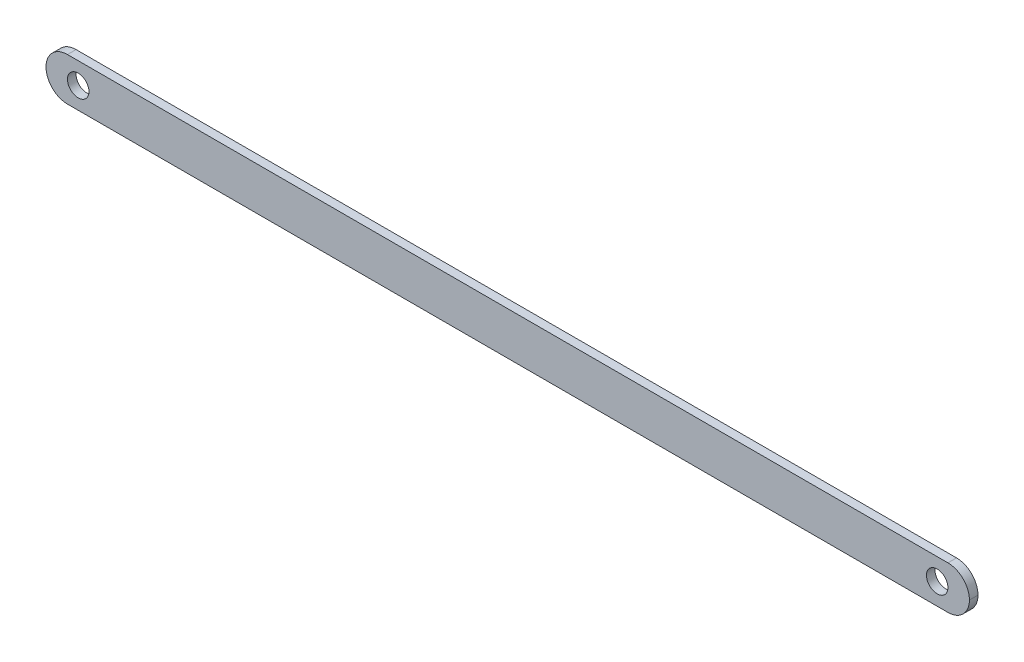
ISO-10303-21;
HEADER;
FILE_DESCRIPTION(('STEP AP214'),'2;1');
FILE_NAME('part.step','',(''),(''),'','','');
FILE_SCHEMA(('AUTOMOTIVE_DESIGN { 1 0 10303 214 1 1 1 1 }'));
ENDSEC;
DATA;
#1=APPLICATION_CONTEXT('core data for automotive mechanical design processes');
#2=APPLICATION_PROTOCOL_DEFINITION('international standard','automotive_design',2000,#1);
#3=PRODUCT_CONTEXT('',#1,'mechanical');
#4=PRODUCT('Part','Part','',(#3));
#5=PRODUCT_RELATED_PRODUCT_CATEGORY('part','',(#4));
#6=PRODUCT_DEFINITION_FORMATION('','',#4);
#7=PRODUCT_DEFINITION_CONTEXT('part definition',#1,'design');
#8=PRODUCT_DEFINITION('design','',#6,#7);
#9=PRODUCT_DEFINITION_SHAPE('','',#8);
#10=(LENGTH_UNIT() NAMED_UNIT(*) SI_UNIT(.MILLI.,.METRE.));
#11=(NAMED_UNIT(*) PLANE_ANGLE_UNIT() SI_UNIT($,.RADIAN.));
#12=(NAMED_UNIT(*) SI_UNIT($,.STERADIAN.) SOLID_ANGLE_UNIT());
#13=UNCERTAINTY_MEASURE_WITH_UNIT(LENGTH_MEASURE(1.E-05),#10,'distance_accuracy_value','');
#14=(GEOMETRIC_REPRESENTATION_CONTEXT(3) GLOBAL_UNCERTAINTY_ASSIGNED_CONTEXT((#13)) GLOBAL_UNIT_ASSIGNED_CONTEXT((#10,
#11,#12)) REPRESENTATION_CONTEXT('',''));
#15=CARTESIAN_POINT('',(0.,0.,0.));
#16=DIRECTION('',(0.,0.,1.));
#17=DIRECTION('',(1.,0.,0.));
#18=AXIS2_PLACEMENT_3D('',#15,#16,#17);
#19=CARTESIAN_POINT('',(107.5,5.00000000000001,-2.));
#20=DIRECTION('',(0.,1.,0.));
#21=DIRECTION('',(-1.,0.,0.));
#22=AXIS2_PLACEMENT_3D('',#19,#20,#21);
#23=PLANE('',#22);
#24=DIRECTION('',(-1.,0.,0.));
#25=VECTOR('',#24,1.);
#26=CARTESIAN_POINT('',(107.5,5.00000000000001,0.));
#27=LINE('',#26,#25);
#28=CARTESIAN_POINT('',(102.5,5.00000000000001,0.));
#29=VERTEX_POINT('',#28);
#30=CARTESIAN_POINT('',(-102.5,4.99999999999999,0.));
#31=VERTEX_POINT('',#30);
#32=EDGE_CURVE('E115',#29,#31,#27,.T.);
#33=ORIENTED_EDGE('',*,*,#32,.F.);
#34=DIRECTION('',(0.,0.,1.));
#35=VECTOR('',#34,1.);
#36=CARTESIAN_POINT('',(102.5,5.00000000000001,-2.));
#37=LINE('',#36,#35);
#38=CARTESIAN_POINT('',(102.5,5.00000000000001,-2.));
#39=VERTEX_POINT('',#38);
#40=EDGE_CURVE('E11',#29,#39,#37,.F.);
#41=ORIENTED_EDGE('',*,*,#40,.T.);
#42=DIRECTION('',(-1.,0.,0.));
#43=VECTOR('',#42,1.);
#44=CARTESIAN_POINT('',(107.5,5.00000000000001,-2.));
#45=LINE('',#44,#43);
#46=CARTESIAN_POINT('',(-102.5,4.99999999999999,-2.));
#47=VERTEX_POINT('',#46);
#48=EDGE_CURVE('E120',#39,#47,#45,.T.);
#49=ORIENTED_EDGE('',*,*,#48,.T.);
#50=DIRECTION('',(0.,0.,1.));
#51=VECTOR('',#50,1.);
#52=CARTESIAN_POINT('',(-102.5,4.99999999999999,-2.));
#53=LINE('',#52,#51);
#54=EDGE_CURVE('E48',#47,#31,#53,.T.);
#55=ORIENTED_EDGE('',*,*,#54,.T.);
#56=EDGE_LOOP('',(#33,#41,#49,#55));
#57=FACE_BOUND('',#56,.T.);
#58=ADVANCED_FACE('F39',(#57),#23,.T.);
#59=CARTESIAN_POINT('',(107.5,-4.99999999999999,-2.));
#60=DIRECTION('',(0.,-1.,0.));
#61=DIRECTION('',(1.,0.,0.));
#62=AXIS2_PLACEMENT_3D('',#59,#60,#61);
#63=PLANE('',#62);
#64=DIRECTION('',(1.,0.,0.));
#65=VECTOR('',#64,1.);
#66=CARTESIAN_POINT('',(107.5,-4.99999999999999,-2.));
#67=LINE('',#66,#65);
#68=CARTESIAN_POINT('',(-102.5,-5.00000000000001,-2.));
#69=VERTEX_POINT('',#68);
#70=CARTESIAN_POINT('',(102.5,-4.99999999999999,-2.));
#71=VERTEX_POINT('',#70);
#72=EDGE_CURVE('E123',#69,#71,#67,.T.);
#73=ORIENTED_EDGE('',*,*,#72,.T.);
#74=DIRECTION('',(0.,0.,1.));
#75=VECTOR('',#74,1.);
#76=CARTESIAN_POINT('',(102.5,-4.99999999999999,-2.));
#77=LINE('',#76,#75);
#78=CARTESIAN_POINT('',(102.5,-4.99999999999999,0.));
#79=VERTEX_POINT('',#78);
#80=EDGE_CURVE('E114',#71,#79,#77,.T.);
#81=ORIENTED_EDGE('',*,*,#80,.T.);
#82=DIRECTION('',(1.,0.,0.));
#83=VECTOR('',#82,1.);
#84=CARTESIAN_POINT('',(107.5,-4.99999999999999,0.));
#85=LINE('',#84,#83);
#86=CARTESIAN_POINT('',(-102.5,-5.00000000000001,0.));
#87=VERTEX_POINT('',#86);
#88=EDGE_CURVE('E96',#87,#79,#85,.T.);
#89=ORIENTED_EDGE('',*,*,#88,.F.);
#90=DIRECTION('',(0.,0.,1.));
#91=VECTOR('',#90,1.);
#92=CARTESIAN_POINT('',(-102.5,-5.00000000000001,-2.));
#93=LINE('',#92,#91);
#94=EDGE_CURVE('E111',#87,#69,#93,.F.);
#95=ORIENTED_EDGE('',*,*,#94,.T.);
#96=EDGE_LOOP('',(#73,#81,#89,#95));
#97=FACE_BOUND('',#96,.T.);
#98=ADVANCED_FACE('F110',(#97),#63,.T.);
#99=CARTESIAN_POINT('',(0.,0.,-2.));
#100=DIRECTION('',(0.,0.,1.));
#101=DIRECTION('',(1.,0.,0.));
#102=AXIS2_PLACEMENT_3D('',#99,#100,#101);
#103=PLANE('',#102);
#104=CARTESIAN_POINT('',(100.,0.,-2.));
#105=DIRECTION('',(0.,0.,1.));
#106=DIRECTION('',(1.,0.,0.));
#107=AXIS2_PLACEMENT_3D('',#104,#105,#106);
#108=CIRCLE('',#107,2.5);
#109=CARTESIAN_POINT('',(102.5,0.,-2.));
#110=VERTEX_POINT('',#109);
#111=EDGE_CURVE('E116',#110,#110,#108,.T.);
#112=ORIENTED_EDGE('',*,*,#111,.T.);
#113=EDGE_LOOP('',(#112));
#114=FACE_BOUND('',#113,.T.);
#115=CARTESIAN_POINT('',(-100.,0.,-2.));
#116=DIRECTION('',(0.,0.,1.));
#117=DIRECTION('',(-1.,0.,0.));
#118=AXIS2_PLACEMENT_3D('',#115,#116,#117);
#119=CIRCLE('',#118,2.5);
#120=CARTESIAN_POINT('',(-102.5,0.,-2.));
#121=VERTEX_POINT('',#120);
#122=EDGE_CURVE('E142',#121,#121,#119,.T.);
#123=ORIENTED_EDGE('',*,*,#122,.T.);
#124=EDGE_LOOP('',(#123));
#125=FACE_BOUND('',#124,.T.);
#126=CARTESIAN_POINT('',(102.5,0.,-2.));
#127=DIRECTION('',(0.,0.,1.));
#128=DIRECTION('',(1.,0.,0.));
#129=AXIS2_PLACEMENT_3D('',#126,#127,#128);
#130=CIRCLE('',#129,5.);
#131=CARTESIAN_POINT('',(107.5,0.,-2.));
#132=VERTEX_POINT('',#131);
#133=EDGE_CURVE('E56',#39,#132,#130,.F.);
#134=ORIENTED_EDGE('',*,*,#133,.T.);
#135=CARTESIAN_POINT('',(102.5,0.,-2.));
#136=DIRECTION('',(0.,0.,1.));
#137=DIRECTION('',(1.,0.,0.));
#138=AXIS2_PLACEMENT_3D('',#135,#136,#137);
#139=CIRCLE('',#138,5.);
#140=EDGE_CURVE('E134',#132,#71,#139,.F.);
#141=ORIENTED_EDGE('',*,*,#140,.T.);
#142=ORIENTED_EDGE('',*,*,#72,.F.);
#143=CARTESIAN_POINT('',(-102.5,0.,-2.));
#144=DIRECTION('',(0.,0.,1.));
#145=DIRECTION('',(1.,0.,0.));
#146=AXIS2_PLACEMENT_3D('',#143,#144,#145);
#147=CIRCLE('',#146,5.);
#148=CARTESIAN_POINT('',(-107.5,0.,-2.));
#149=VERTEX_POINT('',#148);
#150=EDGE_CURVE('E119',#69,#149,#147,.F.);
#151=ORIENTED_EDGE('',*,*,#150,.T.);
#152=CARTESIAN_POINT('',(-102.5,0.,-2.));
#153=DIRECTION('',(0.,0.,1.));
#154=DIRECTION('',(1.,0.,0.));
#155=AXIS2_PLACEMENT_3D('',#152,#153,#154);
#156=CIRCLE('',#155,5.);
#157=EDGE_CURVE('E62',#149,#47,#156,.F.);
#158=ORIENTED_EDGE('',*,*,#157,.T.);
#159=ORIENTED_EDGE('',*,*,#48,.F.);
#160=EDGE_LOOP('',(#134,#141,#142,#151,#158,#159));
#161=FACE_BOUND('',#160,.T.);
#162=ADVANCED_FACE('F160',(#114,#125,#161),#103,.F.);
#163=CARTESIAN_POINT('',(0.,0.,0.));
#164=DIRECTION('',(0.,0.,1.));
#165=DIRECTION('',(1.,0.,0.));
#166=AXIS2_PLACEMENT_3D('',#163,#164,#165);
#167=PLANE('',#166);
#168=CARTESIAN_POINT('',(100.,0.,0.));
#169=DIRECTION('',(0.,0.,1.));
#170=DIRECTION('',(1.,0.,0.));
#171=AXIS2_PLACEMENT_3D('',#168,#169,#170);
#172=CIRCLE('',#171,2.5);
#173=CARTESIAN_POINT('',(102.5,0.,0.));
#174=VERTEX_POINT('',#173);
#175=EDGE_CURVE('E154',#174,#174,#172,.T.);
#176=ORIENTED_EDGE('',*,*,#175,.F.);
#177=EDGE_LOOP('',(#176));
#178=FACE_BOUND('',#177,.T.);
#179=CARTESIAN_POINT('',(-100.,0.,0.));
#180=DIRECTION('',(0.,0.,1.));
#181=DIRECTION('',(-1.,0.,0.));
#182=AXIS2_PLACEMENT_3D('',#179,#180,#181);
#183=CIRCLE('',#182,2.5);
#184=CARTESIAN_POINT('',(-102.5,0.,0.));
#185=VERTEX_POINT('',#184);
#186=EDGE_CURVE('E138',#185,#185,#183,.T.);
#187=ORIENTED_EDGE('',*,*,#186,.F.);
#188=EDGE_LOOP('',(#187));
#189=FACE_BOUND('',#188,.T.);
#190=ORIENTED_EDGE('',*,*,#88,.T.);
#191=CARTESIAN_POINT('',(102.5,0.,0.));
#192=DIRECTION('',(0.,0.,1.));
#193=DIRECTION('',(1.,0.,0.));
#194=AXIS2_PLACEMENT_3D('',#191,#192,#193);
#195=CIRCLE('',#194,5.);
#196=CARTESIAN_POINT('',(107.5,0.,0.));
#197=VERTEX_POINT('',#196);
#198=EDGE_CURVE('E129',#79,#197,#195,.T.);
#199=ORIENTED_EDGE('',*,*,#198,.T.);
#200=CARTESIAN_POINT('',(102.5,0.,0.));
#201=DIRECTION('',(0.,0.,1.));
#202=DIRECTION('',(1.,0.,0.));
#203=AXIS2_PLACEMENT_3D('',#200,#201,#202);
#204=CIRCLE('',#203,5.);
#205=EDGE_CURVE('E104',#197,#29,#204,.T.);
#206=ORIENTED_EDGE('',*,*,#205,.T.);
#207=ORIENTED_EDGE('',*,*,#32,.T.);
#208=CARTESIAN_POINT('',(-102.5,0.,0.));
#209=DIRECTION('',(0.,0.,1.));
#210=DIRECTION('',(1.,0.,0.));
#211=AXIS2_PLACEMENT_3D('',#208,#209,#210);
#212=CIRCLE('',#211,5.);
#213=CARTESIAN_POINT('',(-107.5,0.,0.));
#214=VERTEX_POINT('',#213);
#215=EDGE_CURVE('E99',#31,#214,#212,.T.);
#216=ORIENTED_EDGE('',*,*,#215,.T.);
#217=CARTESIAN_POINT('',(-102.5,0.,0.));
#218=DIRECTION('',(0.,0.,1.));
#219=DIRECTION('',(1.,0.,0.));
#220=AXIS2_PLACEMENT_3D('',#217,#218,#219);
#221=CIRCLE('',#220,5.);
#222=EDGE_CURVE('E93',#214,#87,#221,.T.);
#223=ORIENTED_EDGE('',*,*,#222,.T.);
#224=EDGE_LOOP('',(#190,#199,#206,#207,#216,#223));
#225=FACE_BOUND('',#224,.T.);
#226=ADVANCED_FACE('F95',(#178,#189,#225),#167,.T.);
#227=CARTESIAN_POINT('',(-100.,0.,-2.));
#228=DIRECTION('',(0.,0.,1.));
#229=DIRECTION('',(1.,0.,0.));
#230=AXIS2_PLACEMENT_3D('',#227,#228,#229);
#231=CYLINDRICAL_SURFACE('',#230,2.5);
#232=ORIENTED_EDGE('',*,*,#122,.F.);
#233=EDGE_LOOP('',(#232));
#234=FACE_BOUND('',#233,.T.);
#235=ORIENTED_EDGE('',*,*,#186,.T.);
#236=EDGE_LOOP('',(#235));
#237=FACE_BOUND('',#236,.T.);
#238=ADVANCED_FACE('F167',(#234,#237),#231,.F.);
#239=CARTESIAN_POINT('',(100.,0.,-2.));
#240=DIRECTION('',(0.,0.,1.));
#241=DIRECTION('',(1.,0.,0.));
#242=AXIS2_PLACEMENT_3D('',#239,#240,#241);
#243=CYLINDRICAL_SURFACE('',#242,2.5);
#244=ORIENTED_EDGE('',*,*,#111,.F.);
#245=EDGE_LOOP('',(#244));
#246=FACE_BOUND('',#245,.T.);
#247=ORIENTED_EDGE('',*,*,#175,.T.);
#248=EDGE_LOOP('',(#247));
#249=FACE_BOUND('',#248,.T.);
#250=ADVANCED_FACE('F163',(#246,#249),#243,.F.);
#251=CARTESIAN_POINT('',(102.5,0.,-2.));
#252=DIRECTION('',(0.,0.,1.));
#253=DIRECTION('',(1.,0.,0.));
#254=AXIS2_PLACEMENT_3D('',#251,#252,#253);
#255=CYLINDRICAL_SURFACE('',#254,5.);
#256=DIRECTION('',(0.,0.,1.));
#257=VECTOR('',#256,1.);
#258=CARTESIAN_POINT('',(107.5,0.,-2.));
#259=LINE('',#258,#257);
#260=EDGE_CURVE('E136',#132,#197,#259,.T.);
#261=ORIENTED_EDGE('',*,*,#260,.F.);
#262=ORIENTED_EDGE('',*,*,#133,.F.);
#263=ORIENTED_EDGE('',*,*,#40,.F.);
#264=ORIENTED_EDGE('',*,*,#205,.F.);
#265=EDGE_LOOP('',(#261,#262,#263,#264));
#266=FACE_BOUND('',#265,.T.);
#267=ADVANCED_FACE('F166',(#266),#255,.T.);
#268=CARTESIAN_POINT('',(102.5,0.,-2.));
#269=DIRECTION('',(0.,0.,1.));
#270=DIRECTION('',(1.,0.,0.));
#271=AXIS2_PLACEMENT_3D('',#268,#269,#270);
#272=CYLINDRICAL_SURFACE('',#271,5.);
#273=ORIENTED_EDGE('',*,*,#140,.F.);
#274=ORIENTED_EDGE('',*,*,#260,.T.);
#275=ORIENTED_EDGE('',*,*,#198,.F.);
#276=ORIENTED_EDGE('',*,*,#80,.F.);
#277=EDGE_LOOP('',(#273,#274,#275,#276));
#278=FACE_BOUND('',#277,.T.);
#279=ADVANCED_FACE('F190',(#278),#272,.T.);
#280=CARTESIAN_POINT('',(-102.5,0.,-2.));
#281=DIRECTION('',(0.,0.,1.));
#282=DIRECTION('',(1.,0.,0.));
#283=AXIS2_PLACEMENT_3D('',#280,#281,#282);
#284=CYLINDRICAL_SURFACE('',#283,5.);
#285=ORIENTED_EDGE('',*,*,#54,.F.);
#286=ORIENTED_EDGE('',*,*,#157,.F.);
#287=DIRECTION('',(0.,0.,1.));
#288=VECTOR('',#287,1.);
#289=CARTESIAN_POINT('',(-107.5,0.,-2.));
#290=LINE('',#289,#288);
#291=EDGE_CURVE('E43',#214,#149,#290,.F.);
#292=ORIENTED_EDGE('',*,*,#291,.F.);
#293=ORIENTED_EDGE('',*,*,#215,.F.);
#294=EDGE_LOOP('',(#285,#286,#292,#293));
#295=FACE_BOUND('',#294,.T.);
#296=ADVANCED_FACE('F41',(#295),#284,.T.);
#297=CARTESIAN_POINT('',(-102.5,0.,-2.));
#298=DIRECTION('',(0.,0.,1.));
#299=DIRECTION('',(1.,0.,0.));
#300=AXIS2_PLACEMENT_3D('',#297,#298,#299);
#301=CYLINDRICAL_SURFACE('',#300,5.);
#302=ORIENTED_EDGE('',*,*,#150,.F.);
#303=ORIENTED_EDGE('',*,*,#94,.F.);
#304=ORIENTED_EDGE('',*,*,#222,.F.);
#305=ORIENTED_EDGE('',*,*,#291,.T.);
#306=EDGE_LOOP('',(#302,#303,#304,#305));
#307=FACE_BOUND('',#306,.T.);
#308=ADVANCED_FACE('F118',(#307),#301,.T.);
#309=CLOSED_SHELL('',(#58,#98,#162,#226,#238,#250,#267,#279,#296,#308));
#310=MANIFOLD_SOLID_BREP('B2',#309);
#311=ADVANCED_BREP_SHAPE_REPRESENTATION('',(#18,#310),#14);
#312=SHAPE_DEFINITION_REPRESENTATION(#9,#311);
ENDSEC;
END-ISO-10303-21;
